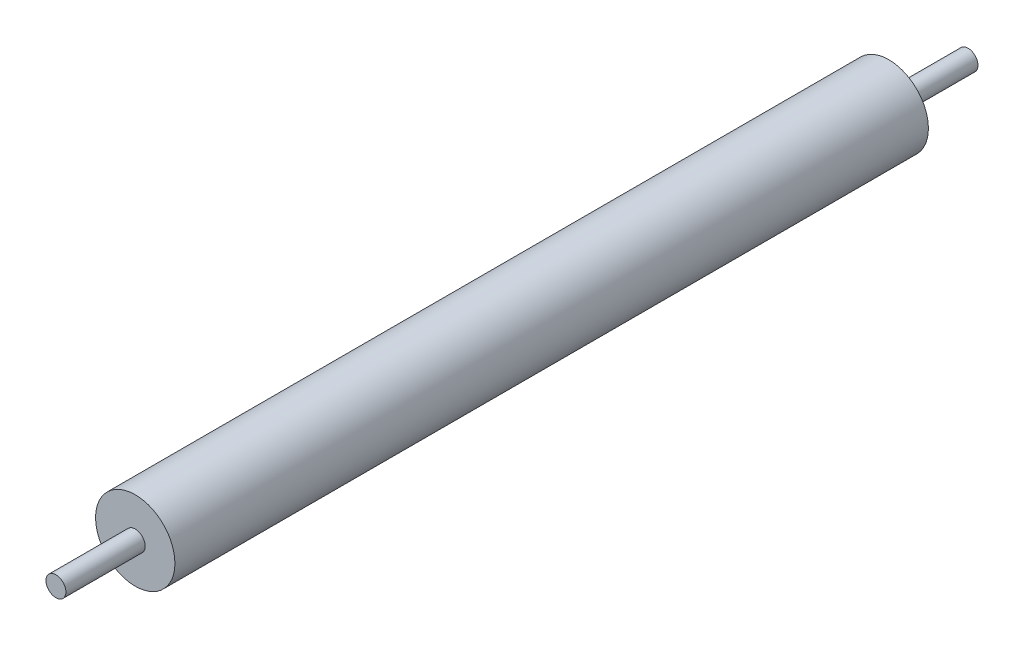
ISO-10303-21;
HEADER;
FILE_DESCRIPTION(('STEP AP214'),'2;1');
FILE_NAME('part.step','',(''),(''),'','','');
FILE_SCHEMA(('AUTOMOTIVE_DESIGN { 1 0 10303 214 1 1 1 1 }'));
ENDSEC;
DATA;
#1=APPLICATION_CONTEXT('core data for automotive mechanical design processes');
#2=APPLICATION_PROTOCOL_DEFINITION('international standard','automotive_design',2000,#1);
#3=PRODUCT_CONTEXT('',#1,'mechanical');
#4=PRODUCT('Part','Part','',(#3));
#5=PRODUCT_RELATED_PRODUCT_CATEGORY('part','',(#4));
#6=PRODUCT_DEFINITION_FORMATION('','',#4);
#7=PRODUCT_DEFINITION_CONTEXT('part definition',#1,'design');
#8=PRODUCT_DEFINITION('design','',#6,#7);
#9=PRODUCT_DEFINITION_SHAPE('','',#8);
#10=(LENGTH_UNIT() NAMED_UNIT(*) SI_UNIT(.MILLI.,.METRE.));
#11=(NAMED_UNIT(*) PLANE_ANGLE_UNIT() SI_UNIT($,.RADIAN.));
#12=(NAMED_UNIT(*) SI_UNIT($,.STERADIAN.) SOLID_ANGLE_UNIT());
#13=UNCERTAINTY_MEASURE_WITH_UNIT(LENGTH_MEASURE(1.E-05),#10,'distance_accuracy_value','');
#14=(GEOMETRIC_REPRESENTATION_CONTEXT(3) GLOBAL_UNCERTAINTY_ASSIGNED_CONTEXT((#13)) GLOBAL_UNIT_ASSIGNED_CONTEXT((#10,
#11,#12)) REPRESENTATION_CONTEXT('',''));
#15=CARTESIAN_POINT('',(0.,0.,0.));
#16=DIRECTION('',(0.,0.,1.));
#17=DIRECTION('',(1.,0.,0.));
#18=AXIS2_PLACEMENT_3D('',#15,#16,#17);
#19=CARTESIAN_POINT('',(0.,0.,584.2));
#20=DIRECTION('',(0.,0.,-1.));
#21=DIRECTION('',(-1.,0.,0.));
#22=AXIS2_PLACEMENT_3D('',#19,#20,#21);
#23=CYLINDRICAL_SURFACE('',#22,25.4);
#24=CARTESIAN_POINT('',(0.,0.,50.8));
#25=DIRECTION('',(0.,0.,1.));
#26=DIRECTION('',(1.,0.,0.));
#27=AXIS2_PLACEMENT_3D('',#24,#25,#26);
#28=CIRCLE('',#27,25.4);
#29=CARTESIAN_POINT('',(25.4,0.,50.8));
#30=VERTEX_POINT('',#29);
#31=EDGE_CURVE('E12',#30,#30,#28,.T.);
#32=ORIENTED_EDGE('',*,*,#31,.T.);
#33=EDGE_LOOP('',(#32));
#34=FACE_BOUND('',#33,.T.);
#35=CARTESIAN_POINT('',(0.,0.,533.4));
#36=DIRECTION('',(0.,0.,1.));
#37=DIRECTION('',(1.,0.,0.));
#38=AXIS2_PLACEMENT_3D('',#35,#36,#37);
#39=CIRCLE('',#38,25.4);
#40=CARTESIAN_POINT('',(25.4,0.,533.4));
#41=VERTEX_POINT('',#40);
#42=EDGE_CURVE('E50',#41,#41,#39,.T.);
#43=ORIENTED_EDGE('',*,*,#42,.F.);
#44=EDGE_LOOP('',(#43));
#45=FACE_BOUND('',#44,.T.);
#46=ADVANCED_FACE('F47',(#34,#45),#23,.T.);
#47=CARTESIAN_POINT('',(0.,0.,50.8));
#48=DIRECTION('',(0.,0.,1.));
#49=DIRECTION('',(1.,0.,0.));
#50=AXIS2_PLACEMENT_3D('',#47,#48,#49);
#51=PLANE('',#50);
#52=CARTESIAN_POINT('',(0.,0.,50.8));
#53=DIRECTION('',(0.,0.,1.));
#54=DIRECTION('',(1.,0.,0.));
#55=AXIS2_PLACEMENT_3D('',#52,#53,#54);
#56=CIRCLE('',#55,6.36193552466987);
#57=CARTESIAN_POINT('',(6.36193552466987,0.,50.8));
#58=VERTEX_POINT('',#57);
#59=EDGE_CURVE('E54',#58,#58,#56,.T.);
#60=ORIENTED_EDGE('',*,*,#59,.T.);
#61=EDGE_LOOP('',(#60));
#62=FACE_BOUND('',#61,.T.);
#63=ORIENTED_EDGE('',*,*,#31,.F.);
#64=EDGE_LOOP('',(#63));
#65=FACE_BOUND('',#64,.T.);
#66=ADVANCED_FACE('F76',(#62,#65),#51,.F.);
#67=CARTESIAN_POINT('',(0.,0.,50.8));
#68=DIRECTION('',(0.,0.,-1.));
#69=DIRECTION('',(-1.,0.,0.));
#70=AXIS2_PLACEMENT_3D('',#67,#68,#69);
#71=CYLINDRICAL_SURFACE('',#70,6.36193552466987);
#72=ORIENTED_EDGE('',*,*,#59,.F.);
#73=EDGE_LOOP('',(#72));
#74=FACE_BOUND('',#73,.T.);
#75=CARTESIAN_POINT('',(0.,0.,0.));
#76=DIRECTION('',(0.,0.,1.));
#77=DIRECTION('',(1.,0.,0.));
#78=AXIS2_PLACEMENT_3D('',#75,#76,#77);
#79=CIRCLE('',#78,6.36193552466987);
#80=CARTESIAN_POINT('',(6.36193552466987,0.,0.));
#81=VERTEX_POINT('',#80);
#82=EDGE_CURVE('E58',#81,#81,#79,.T.);
#83=ORIENTED_EDGE('',*,*,#82,.T.);
#84=EDGE_LOOP('',(#83));
#85=FACE_BOUND('',#84,.T.);
#86=ADVANCED_FACE('F80',(#74,#85),#71,.T.);
#87=CARTESIAN_POINT('',(0.,0.,0.));
#88=DIRECTION('',(0.,0.,1.));
#89=DIRECTION('',(1.,0.,0.));
#90=AXIS2_PLACEMENT_3D('',#87,#88,#89);
#91=PLANE('',#90);
#92=ORIENTED_EDGE('',*,*,#82,.F.);
#93=EDGE_LOOP('',(#92));
#94=FACE_BOUND('',#93,.T.);
#95=ADVANCED_FACE('F86',(#94),#91,.F.);
#96=CARTESIAN_POINT('',(0.,0.,533.4));
#97=DIRECTION('',(0.,0.,1.));
#98=DIRECTION('',(1.,0.,0.));
#99=AXIS2_PLACEMENT_3D('',#96,#97,#98);
#100=PLANE('',#99);
#101=CARTESIAN_POINT('',(0.,0.,533.4));
#102=DIRECTION('',(0.,0.,1.));
#103=DIRECTION('',(1.,0.,0.));
#104=AXIS2_PLACEMENT_3D('',#101,#102,#103);
#105=CIRCLE('',#104,6.37790763137687);
#106=CARTESIAN_POINT('',(6.37790763137687,0.,533.4));
#107=VERTEX_POINT('',#106);
#108=EDGE_CURVE('E66',#107,#107,#105,.T.);
#109=ORIENTED_EDGE('',*,*,#108,.F.);
#110=EDGE_LOOP('',(#109));
#111=FACE_BOUND('',#110,.T.);
#112=ORIENTED_EDGE('',*,*,#42,.T.);
#113=EDGE_LOOP('',(#112));
#114=FACE_BOUND('',#113,.T.);
#115=ADVANCED_FACE('F73',(#111,#114),#100,.T.);
#116=CARTESIAN_POINT('',(0.,0.,533.4));
#117=DIRECTION('',(0.,0.,1.));
#118=DIRECTION('',(1.,0.,0.));
#119=AXIS2_PLACEMENT_3D('',#116,#117,#118);
#120=CYLINDRICAL_SURFACE('',#119,6.37790763137687);
#121=ORIENTED_EDGE('',*,*,#108,.T.);
#122=EDGE_LOOP('',(#121));
#123=FACE_BOUND('',#122,.T.);
#124=CARTESIAN_POINT('',(0.,0.,584.2));
#125=DIRECTION('',(0.,0.,1.));
#126=DIRECTION('',(1.,0.,0.));
#127=AXIS2_PLACEMENT_3D('',#124,#125,#126);
#128=CIRCLE('',#127,6.37790763137687);
#129=CARTESIAN_POINT('',(6.37790763137687,0.,584.2));
#130=VERTEX_POINT('',#129);
#131=EDGE_CURVE('E63',#130,#130,#128,.T.);
#132=ORIENTED_EDGE('',*,*,#131,.F.);
#133=EDGE_LOOP('',(#132));
#134=FACE_BOUND('',#133,.T.);
#135=ADVANCED_FACE('F94',(#123,#134),#120,.T.);
#136=CARTESIAN_POINT('',(0.,0.,584.2));
#137=DIRECTION('',(0.,0.,1.));
#138=DIRECTION('',(1.,0.,0.));
#139=AXIS2_PLACEMENT_3D('',#136,#137,#138);
#140=PLANE('',#139);
#141=ORIENTED_EDGE('',*,*,#131,.T.);
#142=EDGE_LOOP('',(#141));
#143=FACE_BOUND('',#142,.T.);
#144=ADVANCED_FACE('F92',(#143),#140,.T.);
#145=CLOSED_SHELL('',(#46,#66,#86,#95,#115,#135,#144));
#146=MANIFOLD_SOLID_BREP('B2',#145);
#147=ADVANCED_BREP_SHAPE_REPRESENTATION('',(#18,#146),#14);
#148=SHAPE_DEFINITION_REPRESENTATION(#9,#147);
ENDSEC;
END-ISO-10303-21;
